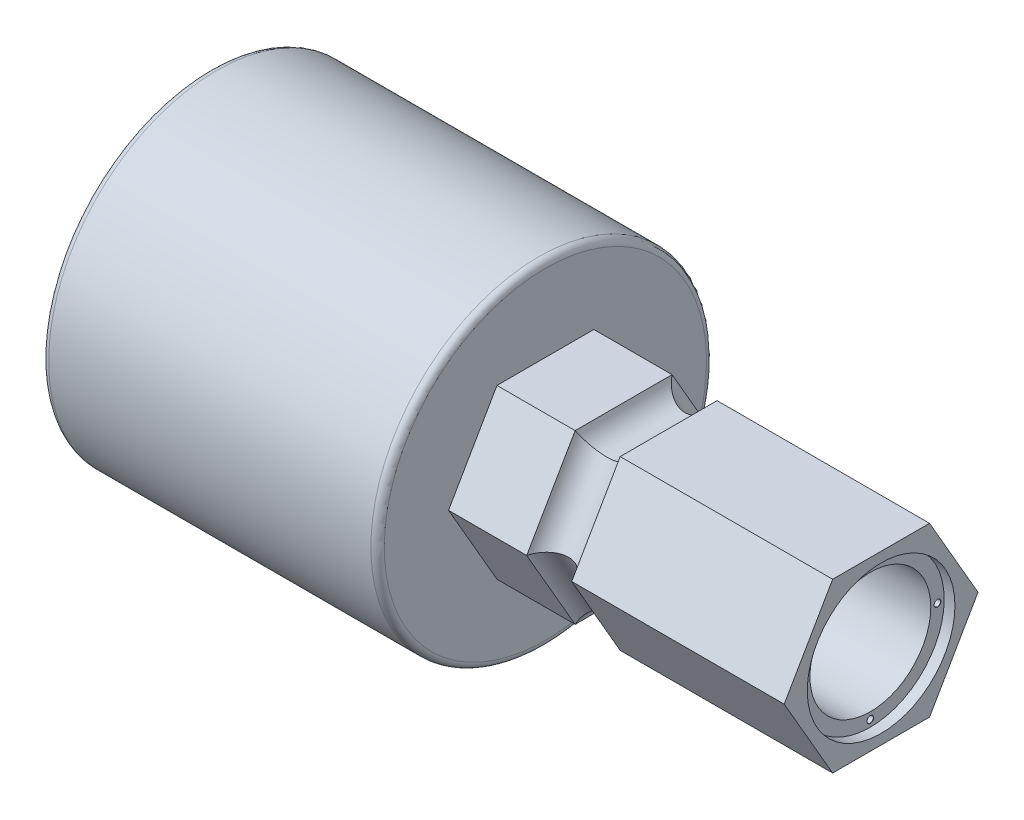
ISO-10303-21;
HEADER;
FILE_DESCRIPTION(('STEP AP214'),'2;1');
FILE_NAME('part.step','',(''),(''),'','','');
FILE_SCHEMA(('AUTOMOTIVE_DESIGN { 1 0 10303 214 1 1 1 1 }'));
ENDSEC;
DATA;
#1=APPLICATION_CONTEXT('core data for automotive mechanical design processes');
#2=APPLICATION_PROTOCOL_DEFINITION('international standard','automotive_design',2000,#1);
#3=PRODUCT_CONTEXT('',#1,'mechanical');
#4=PRODUCT('Part','Part','',(#3));
#5=PRODUCT_RELATED_PRODUCT_CATEGORY('part','',(#4));
#6=PRODUCT_DEFINITION_FORMATION('','',#4);
#7=PRODUCT_DEFINITION_CONTEXT('part definition',#1,'design');
#8=PRODUCT_DEFINITION('design','',#6,#7);
#9=PRODUCT_DEFINITION_SHAPE('','',#8);
#10=(LENGTH_UNIT() NAMED_UNIT(*) SI_UNIT(.MILLI.,.METRE.));
#11=(NAMED_UNIT(*) PLANE_ANGLE_UNIT() SI_UNIT($,.RADIAN.));
#12=(NAMED_UNIT(*) SI_UNIT($,.STERADIAN.) SOLID_ANGLE_UNIT());
#13=UNCERTAINTY_MEASURE_WITH_UNIT(LENGTH_MEASURE(1.E-05),#10,'distance_accuracy_value','');
#14=(GEOMETRIC_REPRESENTATION_CONTEXT(3) GLOBAL_UNCERTAINTY_ASSIGNED_CONTEXT((#13)) GLOBAL_UNIT_ASSIGNED_CONTEXT((#10,
#11,#12)) REPRESENTATION_CONTEXT('',''));
#15=CARTESIAN_POINT('',(0.,0.,0.));
#16=DIRECTION('',(0.,0.,1.));
#17=DIRECTION('',(1.,0.,0.));
#18=AXIS2_PLACEMENT_3D('',#15,#16,#17);
#19=CARTESIAN_POINT('',(135.355339059327,-22.,0.));
#20=DIRECTION('',(-1.,0.,0.));
#21=DIRECTION('',(0.,-1.,0.));
#22=AXIS2_PLACEMENT_3D('',#19,#20,#21);
#23=CYLINDRICAL_SURFACE('',#22,9.);
#24=CARTESIAN_POINT('',(48.,-22.,0.));
#25=DIRECTION('',(1.,0.,0.));
#26=DIRECTION('',(0.,1.,0.));
#27=AXIS2_PLACEMENT_3D('',#24,#25,#26);
#28=CIRCLE('',#27,9.);
#29=CARTESIAN_POINT('',(48.,-13.,0.));
#30=VERTEX_POINT('',#29);
#31=EDGE_CURVE('E11',#30,#30,#28,.F.);
#32=ORIENTED_EDGE('',*,*,#31,.T.);
#33=EDGE_LOOP('',(#32));
#34=FACE_BOUND('',#33,.T.);
#35=CARTESIAN_POINT('',(98.4,-22.,0.));
#36=DIRECTION('',(1.,0.,0.));
#37=DIRECTION('',(0.,0.,-1.));
#38=AXIS2_PLACEMENT_3D('',#35,#36,#37);
#39=CIRCLE('',#38,9.);
#40=CARTESIAN_POINT('',(98.4,-22.,-9.));
#41=VERTEX_POINT('',#40);
#42=EDGE_CURVE('E50',#41,#41,#39,.F.);
#43=ORIENTED_EDGE('',*,*,#42,.F.);
#44=EDGE_LOOP('',(#43));
#45=FACE_BOUND('',#44,.T.);
#46=ADVANCED_FACE('F46',(#34,#45),#23,.F.);
#47=CARTESIAN_POINT('',(48.,-22.,0.));
#48=DIRECTION('',(1.,0.,0.));
#49=DIRECTION('',(0.,1.,0.));
#50=AXIS2_PLACEMENT_3D('',#47,#48,#49);
#51=TOROIDAL_SURFACE('',#50,10.,1.);
#52=CARTESIAN_POINT('',(47.,-22.,0.));
#53=DIRECTION('',(1.,0.,0.));
#54=DIRECTION('',(0.,1.,0.));
#55=AXIS2_PLACEMENT_3D('',#52,#53,#54);
#56=CIRCLE('',#55,10.);
#57=CARTESIAN_POINT('',(47.,-12.,0.));
#58=VERTEX_POINT('',#57);
#59=EDGE_CURVE('E56',#58,#58,#56,.T.);
#60=ORIENTED_EDGE('',*,*,#59,.F.);
#61=EDGE_LOOP('',(#60));
#62=FACE_BOUND('',#61,.T.);
#63=ORIENTED_EDGE('',*,*,#31,.F.);
#64=EDGE_LOOP('',(#63));
#65=FACE_BOUND('',#64,.T.);
#66=ADVANCED_FACE('F48',(#62,#65),#51,.T.);
#67=CARTESIAN_POINT('',(65.,-8.50000000000001,-7.21687836487032));
#68=DIRECTION('',(0.,0.,-1.));
#69=DIRECTION('',(0.,1.,0.));
#70=AXIS2_PLACEMENT_3D('',#67,#68,#69);
#71=CYLINDRICAL_SURFACE('',#70,3.5);
#72=DIRECTION('',(0.,0.,-1.));
#73=VECTOR('',#72,1.);
#74=CARTESIAN_POINT('',(61.6458980337503,-9.49999999999999,-7.21687836487032));
#75=LINE('',#74,#73);
#76=CARTESIAN_POINT('',(61.6458980337503,-9.49999999999998,-7.21687836487032));
#77=VERTEX_POINT('',#76);
#78=CARTESIAN_POINT('',(61.6458980337503,-9.49999999999983,7.21687836487032));
#79=VERTEX_POINT('',#78);
#80=EDGE_CURVE('E255',#77,#79,#75,.F.);
#81=ORIENTED_EDGE('',*,*,#80,.T.);
#82=CARTESIAN_POINT('',(65.,-8.49999999999998,7.79422863405984));
#83=DIRECTION('',(0.,0.499999999999993,-0.866025403784443));
#84=DIRECTION('',(0.,-0.866025403784443,-0.499999999999993));
#85=AXIS2_PLACEMENT_3D('',#82,#83,#84);
#86=ELLIPSE('',#85,4.04145188432737,3.5);
#87=CARTESIAN_POINT('',(68.3541019662497,-9.49999999999984,7.21687836487032));
#88=VERTEX_POINT('',#87);
#89=EDGE_CURVE('E219',#79,#88,#86,.F.);
#90=ORIENTED_EDGE('',*,*,#89,.T.);
#91=DIRECTION('',(0.,0.,-1.));
#92=VECTOR('',#91,1.);
#93=CARTESIAN_POINT('',(68.3541019662497,-9.49999999999999,-7.21687836487032));
#94=LINE('',#93,#92);
#95=CARTESIAN_POINT('',(68.3541019662497,-9.50000000000004,-7.21687836487035));
#96=VERTEX_POINT('',#95);
#97=EDGE_CURVE('E251',#88,#96,#94,.T.);
#98=ORIENTED_EDGE('',*,*,#97,.T.);
#99=CARTESIAN_POINT('',(65.,-8.50000000000001,-7.79422863405999));
#100=DIRECTION('',(0.,-0.500000000000003,-0.866025403784437));
#101=DIRECTION('',(0.,0.866025403784437,-0.500000000000003));
#102=AXIS2_PLACEMENT_3D('',#99,#100,#101);
#103=ELLIPSE('',#102,4.04145188432739,3.5);
#104=EDGE_CURVE('E354',#96,#77,#103,.T.);
#105=ORIENTED_EDGE('',*,*,#104,.T.);
#106=EDGE_LOOP('',(#81,#90,#98,#105));
#107=FACE_BOUND('',#106,.T.);
#108=ADVANCED_FACE('F383',(#107),#71,.F.);
#109=CARTESIAN_POINT('',(100.,-9.49999999999999,7.21687836487032));
#110=DIRECTION('',(0.,-0.5,-0.866025403784439));
#111=DIRECTION('',(0.,0.866025403784439,-0.5));
#112=AXIS2_PLACEMENT_3D('',#109,#110,#111);
#113=PLANE('',#112);
#114=DIRECTION('',(0.,0.866025403784432,-0.500000000000012));
#115=VECTOR('',#114,1.);
#116=CARTESIAN_POINT('',(61.6458980337503,-9.49999999999986,7.21687836487025));
#117=LINE('',#116,#115);
#118=CARTESIAN_POINT('',(61.6458980337503,-21.9999999999999,14.4337567297407));
#119=VERTEX_POINT('',#118);
#120=EDGE_CURVE('E216',#79,#119,#117,.F.);
#121=ORIENTED_EDGE('',*,*,#120,.F.);
#122=DIRECTION('',(-1.,0.,0.));
#123=VECTOR('',#122,1.);
#124=CARTESIAN_POINT('',(100.,-9.49999999999999,7.21687836487032));
#125=LINE('',#124,#123);
#126=CARTESIAN_POINT('',(50.,-9.49999999999999,7.21687836487032));
#127=VERTEX_POINT('',#126);
#128=EDGE_CURVE('E313',#79,#127,#125,.T.);
#129=ORIENTED_EDGE('',*,*,#128,.T.);
#130=DIRECTION('',(0.,-0.866025403784439,0.5));
#131=VECTOR('',#130,1.);
#132=CARTESIAN_POINT('',(50.,-9.49999999999999,7.21687836487032));
#133=LINE('',#132,#131);
#134=CARTESIAN_POINT('',(50.,-22.,14.4337567297407));
#135=VERTEX_POINT('',#134);
#136=EDGE_CURVE('E288',#127,#135,#133,.T.);
#137=ORIENTED_EDGE('',*,*,#136,.T.);
#138=DIRECTION('',(-1.,0.,0.));
#139=VECTOR('',#138,1.);
#140=CARTESIAN_POINT('',(100.,-22.,14.4337567297407));
#141=LINE('',#140,#139);
#142=EDGE_CURVE('E308',#119,#135,#141,.T.);
#143=ORIENTED_EDGE('',*,*,#142,.F.);
#144=EDGE_LOOP('',(#121,#129,#137,#143));
#145=FACE_BOUND('',#144,.T.);
#146=ADVANCED_FACE('F402',(#145),#113,.F.);
#147=DIRECTION('',(0.,0.866025403784432,-0.500000000000012));
#148=VECTOR('',#147,1.);
#149=CARTESIAN_POINT('',(68.3541019662497,-9.49999999999986,7.21687836487025));
#150=LINE('',#149,#148);
#151=CARTESIAN_POINT('',(68.3541019662497,-21.9999999999998,14.4337567297407));
#152=VERTEX_POINT('',#151);
#153=EDGE_CURVE('E213',#152,#88,#150,.T.);
#154=ORIENTED_EDGE('',*,*,#153,.F.);
#155=CARTESIAN_POINT('',(100.,-22.,14.4337567297407));
#156=VERTEX_POINT('',#155);
#157=EDGE_CURVE('E309',#156,#152,#141,.T.);
#158=ORIENTED_EDGE('',*,*,#157,.F.);
#159=DIRECTION('',(0.,-0.866025403784439,0.5));
#160=VECTOR('',#159,1.);
#161=CARTESIAN_POINT('',(100.,-9.49999999999999,7.21687836487032));
#162=LINE('',#161,#160);
#163=CARTESIAN_POINT('',(100.,-9.49999999999999,7.21687836487032));
#164=VERTEX_POINT('',#163);
#165=EDGE_CURVE('E270',#164,#156,#162,.T.);
#166=ORIENTED_EDGE('',*,*,#165,.F.);
#167=EDGE_CURVE('E314',#164,#88,#125,.T.);
#168=ORIENTED_EDGE('',*,*,#167,.T.);
#169=EDGE_LOOP('',(#154,#158,#166,#168));
#170=FACE_BOUND('',#169,.T.);
#171=ADVANCED_FACE('F541',(#170),#113,.F.);
#172=CARTESIAN_POINT('',(65.,-22.4999999999999,15.2997821335251));
#173=DIRECTION('',(0.,0.866025403784444,0.49999999999999));
#174=DIRECTION('',(0.,-0.49999999999999,0.866025403784444));
#175=AXIS2_PLACEMENT_3D('',#172,#173,#174);
#176=CYLINDRICAL_SURFACE('',#175,3.5);
#177=DIRECTION('',(0.,0.866025403784444,0.49999999999999));
#178=VECTOR('',#177,1.);
#179=CARTESIAN_POINT('',(68.3541019662497,-21.9999999999999,14.4337567297407));
#180=LINE('',#179,#178);
#181=CARTESIAN_POINT('',(68.3541019662496,-34.4999999999999,7.21687836487037));
#182=VERTEX_POINT('',#181);
#183=EDGE_CURVE('E223',#182,#152,#180,.T.);
#184=ORIENTED_EDGE('',*,*,#183,.T.);
#185=CARTESIAN_POINT('',(65.,-21.9999999999998,15.5884572681199));
#186=DIRECTION('',(0.,1.,0.));
#187=DIRECTION('',(0.,0.,1.));
#188=AXIS2_PLACEMENT_3D('',#185,#186,#187);
#189=ELLIPSE('',#188,4.04145188432739,3.5);
#190=EDGE_CURVE('E370',#152,#119,#189,.T.);
#191=ORIENTED_EDGE('',*,*,#190,.T.);
#192=DIRECTION('',(0.,0.866025403784444,0.49999999999999));
#193=VECTOR('',#192,1.);
#194=CARTESIAN_POINT('',(61.6458980337503,-21.9999999999999,14.4337567297407));
#195=LINE('',#194,#193);
#196=CARTESIAN_POINT('',(61.6458980337503,-34.5,7.21687836487036));
#197=VERTEX_POINT('',#196);
#198=EDGE_CURVE('E227',#119,#197,#195,.F.);
#199=ORIENTED_EDGE('',*,*,#198,.T.);
#200=CARTESIAN_POINT('',(65.,-35.5,7.79422863406009));
#201=DIRECTION('',(0.,0.500000000000006,0.866025403784435));
#202=DIRECTION('',(0.,-0.866025403784435,0.500000000000006));
#203=AXIS2_PLACEMENT_3D('',#200,#201,#202);
#204=ELLIPSE('',#203,4.04145188432739,3.5);
#205=EDGE_CURVE('E366',#182,#197,#204,.T.);
#206=ORIENTED_EDGE('',*,*,#205,.F.);
#207=EDGE_LOOP('',(#184,#191,#199,#206));
#208=FACE_BOUND('',#207,.T.);
#209=ADVANCED_FACE('F418',(#208),#176,.F.);
#210=CARTESIAN_POINT('',(100.,-22.,14.4337567297407));
#211=DIRECTION('',(0.,0.5,-0.866025403784438));
#212=DIRECTION('',(0.,0.866025403784438,0.5));
#213=AXIS2_PLACEMENT_3D('',#210,#211,#212);
#214=PLANE('',#213);
#215=ORIENTED_EDGE('',*,*,#198,.F.);
#216=ORIENTED_EDGE('',*,*,#142,.T.);
#217=DIRECTION('',(0.,-0.866025403784438,-0.5));
#218=VECTOR('',#217,1.);
#219=CARTESIAN_POINT('',(50.,-22.,14.4337567297407));
#220=LINE('',#219,#218);
#221=CARTESIAN_POINT('',(50.,-34.5,7.21687836487033));
#222=VERTEX_POINT('',#221);
#223=EDGE_CURVE('E292',#135,#222,#220,.T.);
#224=ORIENTED_EDGE('',*,*,#223,.T.);
#225=DIRECTION('',(-1.,0.,0.));
#226=VECTOR('',#225,1.);
#227=CARTESIAN_POINT('',(100.,-34.5,7.21687836487033));
#228=LINE('',#227,#226);
#229=EDGE_CURVE('E303',#197,#222,#228,.T.);
#230=ORIENTED_EDGE('',*,*,#229,.F.);
#231=EDGE_LOOP('',(#215,#216,#224,#230));
#232=FACE_BOUND('',#231,.T.);
#233=ADVANCED_FACE('F416',(#232),#214,.F.);
#234=ORIENTED_EDGE('',*,*,#183,.F.);
#235=CARTESIAN_POINT('',(100.,-34.5,7.21687836487033));
#236=VERTEX_POINT('',#235);
#237=EDGE_CURVE('E304',#236,#182,#228,.T.);
#238=ORIENTED_EDGE('',*,*,#237,.F.);
#239=DIRECTION('',(0.,-0.866025403784438,-0.5));
#240=VECTOR('',#239,1.);
#241=CARTESIAN_POINT('',(100.,-22.,14.4337567297407));
#242=LINE('',#241,#240);
#243=EDGE_CURVE('E273',#156,#236,#242,.T.);
#244=ORIENTED_EDGE('',*,*,#243,.F.);
#245=ORIENTED_EDGE('',*,*,#157,.T.);
#246=EDGE_LOOP('',(#234,#238,#244,#245));
#247=FACE_BOUND('',#246,.T.);
#248=ADVANCED_FACE('F559',(#247),#214,.F.);
#249=CARTESIAN_POINT('',(65.,-35.5,7.21687836487036));
#250=DIRECTION('',(0.,0.,1.));
#251=DIRECTION('',(0.,-1.,0.));
#252=AXIS2_PLACEMENT_3D('',#249,#250,#251);
#253=CYLINDRICAL_SURFACE('',#252,3.5);
#254=DIRECTION('',(0.,0.,1.));
#255=VECTOR('',#254,1.);
#256=CARTESIAN_POINT('',(68.3541019662497,-34.5,7.21687836487035));
#257=LINE('',#256,#255);
#258=CARTESIAN_POINT('',(68.3541019662497,-34.5000000000001,-7.21687836487029));
#259=VERTEX_POINT('',#258);
#260=EDGE_CURVE('E230',#259,#182,#257,.T.);
#261=ORIENTED_EDGE('',*,*,#260,.T.);
#262=ORIENTED_EDGE('',*,*,#205,.T.);
#263=DIRECTION('',(0.,0.,1.));
#264=VECTOR('',#263,1.);
#265=CARTESIAN_POINT('',(61.6458980337503,-34.5,7.21687836487036));
#266=LINE('',#265,#264);
#267=CARTESIAN_POINT('',(61.6458980337504,-34.5,-7.21687836487015));
#268=VERTEX_POINT('',#267);
#269=EDGE_CURVE('E234',#197,#268,#266,.F.);
#270=ORIENTED_EDGE('',*,*,#269,.T.);
#271=CARTESIAN_POINT('',(65.,-35.5,-7.79422863405987));
#272=DIRECTION('',(0.,-0.499999999999996,0.866025403784441));
#273=DIRECTION('',(0.,-0.866025403784441,-0.499999999999996));
#274=AXIS2_PLACEMENT_3D('',#271,#272,#273);
#275=ELLIPSE('',#274,4.04145188432738,3.5);
#276=EDGE_CURVE('E362',#259,#268,#275,.T.);
#277=ORIENTED_EDGE('',*,*,#276,.F.);
#278=EDGE_LOOP('',(#261,#262,#270,#277));
#279=FACE_BOUND('',#278,.T.);
#280=ADVANCED_FACE('F422',(#279),#253,.F.);
#281=CARTESIAN_POINT('',(100.,-34.5,7.21687836487033));
#282=DIRECTION('',(0.,1.,0.));
#283=DIRECTION('',(-1.,0.,0.));
#284=AXIS2_PLACEMENT_3D('',#281,#282,#283);
#285=PLANE('',#284);
#286=ORIENTED_EDGE('',*,*,#269,.F.);
#287=ORIENTED_EDGE('',*,*,#229,.T.);
#288=DIRECTION('',(0.,0.,-1.));
#289=VECTOR('',#288,1.);
#290=CARTESIAN_POINT('',(50.,-34.5,7.21687836487033));
#291=LINE('',#290,#289);
#292=CARTESIAN_POINT('',(50.,-34.5,-7.21687836487032));
#293=VERTEX_POINT('',#292);
#294=EDGE_CURVE('E264',#222,#293,#291,.T.);
#295=ORIENTED_EDGE('',*,*,#294,.T.);
#296=DIRECTION('',(-1.,0.,0.));
#297=VECTOR('',#296,1.);
#298=CARTESIAN_POINT('',(100.,-34.5,-7.21687836487032));
#299=LINE('',#298,#297);
#300=EDGE_CURVE('E279',#268,#293,#299,.T.);
#301=ORIENTED_EDGE('',*,*,#300,.F.);
#302=EDGE_LOOP('',(#286,#287,#295,#301));
#303=FACE_BOUND('',#302,.T.);
#304=ADVANCED_FACE('F426',(#303),#285,.F.);
#305=ORIENTED_EDGE('',*,*,#260,.F.);
#306=CARTESIAN_POINT('',(100.,-34.5,-7.21687836487032));
#307=VERTEX_POINT('',#306);
#308=EDGE_CURVE('E299',#307,#259,#299,.T.);
#309=ORIENTED_EDGE('',*,*,#308,.F.);
#310=DIRECTION('',(0.,0.,-1.));
#311=VECTOR('',#310,1.);
#312=CARTESIAN_POINT('',(100.,-34.5,7.21687836487033));
#313=LINE('',#312,#311);
#314=EDGE_CURVE('E276',#236,#307,#313,.T.);
#315=ORIENTED_EDGE('',*,*,#314,.F.);
#316=ORIENTED_EDGE('',*,*,#237,.T.);
#317=EDGE_LOOP('',(#305,#309,#315,#316));
#318=FACE_BOUND('',#317,.T.);
#319=ADVANCED_FACE('F579',(#318),#285,.F.);
#320=CARTESIAN_POINT('',(65.,-35.0000000000001,-8.08290376865468));
#321=DIRECTION('',(0.,-0.866025403784435,0.500000000000006));
#322=DIRECTION('',(0.,-0.500000000000006,-0.866025403784435));
#323=AXIS2_PLACEMENT_3D('',#320,#321,#322);
#324=CYLINDRICAL_SURFACE('',#323,3.5);
#325=DIRECTION('',(0.,-0.866025403784435,0.500000000000006));
#326=VECTOR('',#325,1.);
#327=CARTESIAN_POINT('',(68.3541019662497,-34.5000000000001,-7.21687836487028));
#328=LINE('',#327,#326);
#329=CARTESIAN_POINT('',(68.3541019662497,-22.0000000000001,-14.4337567297406));
#330=VERTEX_POINT('',#329);
#331=EDGE_CURVE('E237',#330,#259,#328,.T.);
#332=ORIENTED_EDGE('',*,*,#331,.T.);
#333=ORIENTED_EDGE('',*,*,#276,.T.);
#334=DIRECTION('',(0.,-0.866025403784435,0.500000000000006));
#335=VECTOR('',#334,1.);
#336=CARTESIAN_POINT('',(61.6458980337503,-34.5000000000001,-7.21687836487027));
#337=LINE('',#336,#335);
#338=CARTESIAN_POINT('',(61.6458980337503,-22.,-14.4337567297407));
#339=VERTEX_POINT('',#338);
#340=EDGE_CURVE('E241',#268,#339,#337,.F.);
#341=ORIENTED_EDGE('',*,*,#340,.T.);
#342=CARTESIAN_POINT('',(65.,-22.0000000000001,-15.5884572681199));
#343=DIRECTION('',(0.,-1.,0.));
#344=DIRECTION('',(0.,0.,-1.));
#345=AXIS2_PLACEMENT_3D('',#342,#343,#344);
#346=ELLIPSE('',#345,4.04145188432739,3.5);
#347=EDGE_CURVE('E358',#330,#339,#346,.T.);
#348=ORIENTED_EDGE('',*,*,#347,.F.);
#349=EDGE_LOOP('',(#332,#333,#341,#348));
#350=FACE_BOUND('',#349,.T.);
#351=ADVANCED_FACE('F431',(#350),#324,.F.);
#352=CARTESIAN_POINT('',(100.,-34.5,-7.21687836487032));
#353=DIRECTION('',(0.,0.499999999999999,0.866025403784439));
#354=DIRECTION('',(0.,-0.866025403784439,0.499999999999999));
#355=AXIS2_PLACEMENT_3D('',#352,#353,#354);
#356=PLANE('',#355);
#357=ORIENTED_EDGE('',*,*,#340,.F.);
#358=ORIENTED_EDGE('',*,*,#300,.T.);
#359=DIRECTION('',(0.,0.866025403784439,-0.499999999999999));
#360=VECTOR('',#359,1.);
#361=CARTESIAN_POINT('',(50.,-34.5,-7.21687836487032));
#362=LINE('',#361,#360);
#363=CARTESIAN_POINT('',(50.,-22.,-14.4337567297406));
#364=VERTEX_POINT('',#363);
#365=EDGE_CURVE('E259',#293,#364,#362,.T.);
#366=ORIENTED_EDGE('',*,*,#365,.T.);
#367=DIRECTION('',(-1.,0.,0.));
#368=VECTOR('',#367,1.);
#369=CARTESIAN_POINT('',(100.,-22.,-14.4337567297406));
#370=LINE('',#369,#368);
#371=EDGE_CURVE('E63',#339,#364,#370,.T.);
#372=ORIENTED_EDGE('',*,*,#371,.F.);
#373=EDGE_LOOP('',(#357,#358,#366,#372));
#374=FACE_BOUND('',#373,.T.);
#375=ADVANCED_FACE('F429',(#374),#356,.F.);
#376=ORIENTED_EDGE('',*,*,#331,.F.);
#377=CARTESIAN_POINT('',(100.,-22.,-14.4337567297406));
#378=VERTEX_POINT('',#377);
#379=EDGE_CURVE('E322',#378,#330,#370,.T.);
#380=ORIENTED_EDGE('',*,*,#379,.F.);
#381=DIRECTION('',(0.,0.866025403784439,-0.499999999999999));
#382=VECTOR('',#381,1.);
#383=CARTESIAN_POINT('',(100.,-34.5,-7.21687836487032));
#384=LINE('',#383,#382);
#385=EDGE_CURVE('E260',#307,#378,#384,.T.);
#386=ORIENTED_EDGE('',*,*,#385,.F.);
#387=ORIENTED_EDGE('',*,*,#308,.T.);
#388=EDGE_LOOP('',(#376,#380,#386,#387));
#389=FACE_BOUND('',#388,.T.);
#390=ADVANCED_FACE('F445',(#389),#356,.F.);
#391=CARTESIAN_POINT('',(65.,-21.5000000000001,-15.2997821335251));
#392=DIRECTION('',(0.,-0.866025403784441,-0.499999999999996));
#393=DIRECTION('',(0.,0.499999999999996,-0.866025403784441));
#394=AXIS2_PLACEMENT_3D('',#391,#392,#393);
#395=CYLINDRICAL_SURFACE('',#394,3.5);
#396=DIRECTION('',(0.,-0.866025403784441,-0.499999999999996));
#397=VECTOR('',#396,1.);
#398=CARTESIAN_POINT('',(68.3541019662497,-22.,-14.4337567297407));
#399=LINE('',#398,#397);
#400=EDGE_CURVE('E244',#96,#330,#399,.T.);
#401=ORIENTED_EDGE('',*,*,#400,.T.);
#402=ORIENTED_EDGE('',*,*,#347,.T.);
#403=DIRECTION('',(0.,-0.866025403784441,-0.499999999999996));
#404=VECTOR('',#403,1.);
#405=CARTESIAN_POINT('',(61.6458980337503,-22.,-14.4337567297407));
#406=LINE('',#405,#404);
#407=EDGE_CURVE('E248',#339,#77,#406,.F.);
#408=ORIENTED_EDGE('',*,*,#407,.T.);
#409=ORIENTED_EDGE('',*,*,#104,.F.);
#410=EDGE_LOOP('',(#401,#402,#408,#409));
#411=FACE_BOUND('',#410,.T.);
#412=ADVANCED_FACE('F434',(#411),#395,.F.);
#413=CARTESIAN_POINT('',(100.,-22.,-14.4337567297406));
#414=DIRECTION('',(0.,-0.5,0.866025403784439));
#415=DIRECTION('',(0.,-0.866025403784439,-0.5));
#416=AXIS2_PLACEMENT_3D('',#413,#414,#415);
#417=PLANE('',#416);
#418=ORIENTED_EDGE('',*,*,#407,.F.);
#419=ORIENTED_EDGE('',*,*,#371,.T.);
#420=DIRECTION('',(0.,0.866025403784439,0.5));
#421=VECTOR('',#420,1.);
#422=CARTESIAN_POINT('',(50.,-22.,-14.4337567297406));
#423=LINE('',#422,#421);
#424=CARTESIAN_POINT('',(50.,-9.49999999999999,-7.21687836487032));
#425=VERTEX_POINT('',#424);
#426=EDGE_CURVE('E282',#364,#425,#423,.T.);
#427=ORIENTED_EDGE('',*,*,#426,.T.);
#428=DIRECTION('',(-1.,0.,0.));
#429=VECTOR('',#428,1.);
#430=CARTESIAN_POINT('',(100.,-9.49999999999999,-7.21687836487032));
#431=LINE('',#430,#429);
#432=EDGE_CURVE('E71',#77,#425,#431,.T.);
#433=ORIENTED_EDGE('',*,*,#432,.F.);
#434=EDGE_LOOP('',(#418,#419,#427,#433));
#435=FACE_BOUND('',#434,.T.);
#436=ADVANCED_FACE('F436',(#435),#417,.F.);
#437=ORIENTED_EDGE('',*,*,#400,.F.);
#438=CARTESIAN_POINT('',(100.,-9.49999999999999,-7.21687836487032));
#439=VERTEX_POINT('',#438);
#440=EDGE_CURVE('E318',#439,#96,#431,.T.);
#441=ORIENTED_EDGE('',*,*,#440,.F.);
#442=DIRECTION('',(0.,0.866025403784439,0.5));
#443=VECTOR('',#442,1.);
#444=CARTESIAN_POINT('',(100.,-22.,-14.4337567297406));
#445=LINE('',#444,#443);
#446=EDGE_CURVE('E263',#378,#439,#445,.T.);
#447=ORIENTED_EDGE('',*,*,#446,.F.);
#448=ORIENTED_EDGE('',*,*,#379,.T.);
#449=EDGE_LOOP('',(#437,#441,#447,#448));
#450=FACE_BOUND('',#449,.T.);
#451=ADVANCED_FACE('F438',(#450),#417,.F.);
#452=CARTESIAN_POINT('',(100.,-9.49999999999999,-7.21687836487032));
#453=DIRECTION('',(0.,-1.,0.));
#454=DIRECTION('',(1.,0.,0.));
#455=AXIS2_PLACEMENT_3D('',#452,#453,#454);
#456=PLANE('',#455);
#457=ORIENTED_EDGE('',*,*,#80,.F.);
#458=ORIENTED_EDGE('',*,*,#432,.T.);
#459=DIRECTION('',(0.,0.,1.));
#460=VECTOR('',#459,1.);
#461=CARTESIAN_POINT('',(50.,-9.49999999999999,-7.21687836487032));
#462=LINE('',#461,#460);
#463=EDGE_CURVE('E285',#425,#127,#462,.T.);
#464=ORIENTED_EDGE('',*,*,#463,.T.);
#465=ORIENTED_EDGE('',*,*,#128,.F.);
#466=EDGE_LOOP('',(#457,#458,#464,#465));
#467=FACE_BOUND('',#466,.T.);
#468=ADVANCED_FACE('F407',(#467),#456,.F.);
#469=ORIENTED_EDGE('',*,*,#97,.F.);
#470=ORIENTED_EDGE('',*,*,#167,.F.);
#471=DIRECTION('',(0.,0.,1.));
#472=VECTOR('',#471,1.);
#473=CARTESIAN_POINT('',(100.,-9.49999999999999,-7.21687836487032));
#474=LINE('',#473,#472);
#475=EDGE_CURVE('E267',#439,#164,#474,.T.);
#476=ORIENTED_EDGE('',*,*,#475,.F.);
#477=ORIENTED_EDGE('',*,*,#440,.T.);
#478=EDGE_LOOP('',(#469,#470,#476,#477));
#479=FACE_BOUND('',#478,.T.);
#480=ADVANCED_FACE('F464',(#479),#456,.F.);
#481=CARTESIAN_POINT('',(50.,0.,0.));
#482=DIRECTION('',(-1.,0.,0.));
#483=DIRECTION('',(0.,-1.,0.));
#484=AXIS2_PLACEMENT_3D('',#481,#482,#483);
#485=PLANE('',#484);
#486=CARTESIAN_POINT('',(50.,-22.,0.));
#487=DIRECTION('',(1.,0.,0.));
#488=DIRECTION('',(0.,1.,0.));
#489=AXIS2_PLACEMENT_3D('',#486,#487,#488);
#490=CIRCLE('',#489,24.);
#491=CARTESIAN_POINT('',(50.,1.99999999999999,0.));
#492=VERTEX_POINT('',#491);
#493=EDGE_CURVE('E334',#492,#492,#490,.T.);
#494=ORIENTED_EDGE('',*,*,#493,.T.);
#495=EDGE_LOOP('',(#494));
#496=FACE_BOUND('',#495,.T.);
#497=ORIENTED_EDGE('',*,*,#365,.F.);
#498=ORIENTED_EDGE('',*,*,#294,.F.);
#499=ORIENTED_EDGE('',*,*,#223,.F.);
#500=ORIENTED_EDGE('',*,*,#136,.F.);
#501=ORIENTED_EDGE('',*,*,#463,.F.);
#502=ORIENTED_EDGE('',*,*,#426,.F.);
#503=EDGE_LOOP('',(#497,#498,#499,#500,#501,#502));
#504=FACE_BOUND('',#503,.T.);
#505=ADVANCED_FACE('F411',(#496,#504),#485,.F.);
#506=CARTESIAN_POINT('',(1.,-22.,0.));
#507=DIRECTION('',(1.,0.,0.));
#508=DIRECTION('',(0.,1.,0.));
#509=AXIS2_PLACEMENT_3D('',#506,#507,#508);
#510=TOROIDAL_SURFACE('',#509,24.,1.);
#511=CARTESIAN_POINT('',(1.00000000000001,-22.,0.));
#512=DIRECTION('',(1.,0.,0.));
#513=DIRECTION('',(0.,1.,0.));
#514=AXIS2_PLACEMENT_3D('',#511,#512,#513);
#515=CIRCLE('',#514,25.);
#516=CARTESIAN_POINT('',(1.00000000000001,3.,0.));
#517=VERTEX_POINT('',#516);
#518=EDGE_CURVE('E326',#517,#517,#515,.T.);
#519=ORIENTED_EDGE('',*,*,#518,.F.);
#520=EDGE_LOOP('',(#519));
#521=FACE_BOUND('',#520,.T.);
#522=CARTESIAN_POINT('',(0.,-22.,0.));
#523=DIRECTION('',(1.,0.,0.));
#524=DIRECTION('',(0.,1.,0.));
#525=AXIS2_PLACEMENT_3D('',#522,#523,#524);
#526=CIRCLE('',#525,24.);
#527=CARTESIAN_POINT('',(0.,1.99999999999999,0.));
#528=VERTEX_POINT('',#527);
#529=EDGE_CURVE('E350',#528,#528,#526,.T.);
#530=ORIENTED_EDGE('',*,*,#529,.T.);
#531=EDGE_LOOP('',(#530));
#532=FACE_BOUND('',#531,.T.);
#533=ADVANCED_FACE('F463',(#521,#532),#510,.T.);
#534=CARTESIAN_POINT('',(0.,0.,0.));
#535=DIRECTION('',(1.,0.,0.));
#536=DIRECTION('',(0.,1.,0.));
#537=AXIS2_PLACEMENT_3D('',#534,#535,#536);
#538=PLANE('',#537);
#539=ORIENTED_EDGE('',*,*,#529,.F.);
#540=EDGE_LOOP('',(#539));
#541=FACE_BOUND('',#540,.T.);
#542=CARTESIAN_POINT('',(0.,-22.,0.));
#543=DIRECTION('',(1.,0.,0.));
#544=DIRECTION('',(0.,1.,0.));
#545=AXIS2_PLACEMENT_3D('',#542,#543,#544);
#546=CIRCLE('',#545,22.);
#547=CARTESIAN_POINT('',(0.,0.,0.));
#548=VERTEX_POINT('',#547);
#549=EDGE_CURVE('E346',#548,#548,#546,.T.);
#550=ORIENTED_EDGE('',*,*,#549,.T.);
#551=EDGE_LOOP('',(#550));
#552=FACE_BOUND('',#551,.T.);
#553=ADVANCED_FACE('F475',(#541,#552),#538,.F.);
#554=CARTESIAN_POINT('',(50.,-22.,0.));
#555=DIRECTION('',(1.,0.,0.));
#556=DIRECTION('',(0.,1.,0.));
#557=AXIS2_PLACEMENT_3D('',#554,#555,#556);
#558=CYLINDRICAL_SURFACE('',#557,22.);
#559=ORIENTED_EDGE('',*,*,#549,.F.);
#560=EDGE_LOOP('',(#559));
#561=FACE_BOUND('',#560,.T.);
#562=CARTESIAN_POINT('',(46.,-22.,0.));
#563=DIRECTION('',(1.,0.,0.));
#564=DIRECTION('',(0.,1.,0.));
#565=AXIS2_PLACEMENT_3D('',#562,#563,#564);
#566=CIRCLE('',#565,22.);
#567=CARTESIAN_POINT('',(46.,0.,0.));
#568=VERTEX_POINT('',#567);
#569=EDGE_CURVE('E342',#568,#568,#566,.T.);
#570=ORIENTED_EDGE('',*,*,#569,.T.);
#571=EDGE_LOOP('',(#570));
#572=FACE_BOUND('',#571,.T.);
#573=ADVANCED_FACE('F471',(#561,#572),#558,.F.);
#574=CARTESIAN_POINT('',(46.,-22.,0.));
#575=DIRECTION('',(1.,0.,0.));
#576=DIRECTION('',(0.,1.,0.));
#577=AXIS2_PLACEMENT_3D('',#574,#575,#576);
#578=TOROIDAL_SURFACE('',#577,21.,1.);
#579=ORIENTED_EDGE('',*,*,#569,.F.);
#580=EDGE_LOOP('',(#579));
#581=FACE_BOUND('',#580,.T.);
#582=CARTESIAN_POINT('',(47.,-22.,0.));
#583=DIRECTION('',(1.,0.,0.));
#584=DIRECTION('',(0.,1.,0.));
#585=AXIS2_PLACEMENT_3D('',#582,#583,#584);
#586=CIRCLE('',#585,21.);
#587=CARTESIAN_POINT('',(47.,-1.,0.));
#588=VERTEX_POINT('',#587);
#589=EDGE_CURVE('E338',#588,#588,#586,.T.);
#590=ORIENTED_EDGE('',*,*,#589,.T.);
#591=EDGE_LOOP('',(#590));
#592=FACE_BOUND('',#591,.T.);
#593=ADVANCED_FACE('F468',(#581,#592),#578,.F.);
#594=CARTESIAN_POINT('',(47.,0.,0.));
#595=DIRECTION('',(1.,0.,0.));
#596=DIRECTION('',(0.,1.,0.));
#597=AXIS2_PLACEMENT_3D('',#594,#595,#596);
#598=PLANE('',#597);
#599=ORIENTED_EDGE('',*,*,#59,.T.);
#600=EDGE_LOOP('',(#599));
#601=FACE_BOUND('',#600,.T.);
#602=ORIENTED_EDGE('',*,*,#589,.F.);
#603=EDGE_LOOP('',(#602));
#604=FACE_BOUND('',#603,.T.);
#605=ADVANCED_FACE('F378',(#601,#604),#598,.F.);
#606=CARTESIAN_POINT('',(49.,-22.,0.));
#607=DIRECTION('',(1.,0.,0.));
#608=DIRECTION('',(0.,1.,0.));
#609=AXIS2_PLACEMENT_3D('',#606,#607,#608);
#610=TOROIDAL_SURFACE('',#609,24.,1.);
#611=CARTESIAN_POINT('',(49.,-22.,0.));
#612=DIRECTION('',(1.,0.,0.));
#613=DIRECTION('',(0.,1.,0.));
#614=AXIS2_PLACEMENT_3D('',#611,#612,#613);
#615=CIRCLE('',#614,25.);
#616=CARTESIAN_POINT('',(49.,3.,0.));
#617=VERTEX_POINT('',#616);
#618=EDGE_CURVE('E330',#617,#617,#615,.T.);
#619=ORIENTED_EDGE('',*,*,#618,.T.);
#620=EDGE_LOOP('',(#619));
#621=FACE_BOUND('',#620,.T.);
#622=ORIENTED_EDGE('',*,*,#493,.F.);
#623=EDGE_LOOP('',(#622));
#624=FACE_BOUND('',#623,.T.);
#625=ADVANCED_FACE('F456',(#621,#624),#610,.T.);
#626=CARTESIAN_POINT('',(50.,-22.,0.));
#627=DIRECTION('',(1.,0.,0.));
#628=DIRECTION('',(0.,1.,0.));
#629=AXIS2_PLACEMENT_3D('',#626,#627,#628);
#630=CYLINDRICAL_SURFACE('',#629,25.);
#631=ORIENTED_EDGE('',*,*,#618,.F.);
#632=EDGE_LOOP('',(#631));
#633=FACE_BOUND('',#632,.T.);
#634=ORIENTED_EDGE('',*,*,#518,.T.);
#635=EDGE_LOOP('',(#634));
#636=FACE_BOUND('',#635,.T.);
#637=ADVANCED_FACE('F452',(#633,#636),#630,.T.);
#638=CARTESIAN_POINT('',(100.,0.,0.));
#639=DIRECTION('',(1.,0.,0.));
#640=DIRECTION('',(0.,0.,-1.));
#641=AXIS2_PLACEMENT_3D('',#638,#639,#640);
#642=PLANE('',#641);
#643=CARTESIAN_POINT('',(100.,-22.,0.));
#644=DIRECTION('',(1.,0.,0.));
#645=DIRECTION('',(0.,0.,-1.));
#646=AXIS2_PLACEMENT_3D('',#643,#644,#645);
#647=CIRCLE('',#646,11.);
#648=CARTESIAN_POINT('',(100.,-22.,-11.));
#649=VERTEX_POINT('',#648);
#650=EDGE_CURVE('E205',#649,#649,#647,.T.);
#651=ORIENTED_EDGE('',*,*,#650,.F.);
#652=EDGE_LOOP('',(#651));
#653=FACE_BOUND('',#652,.T.);
#654=ORIENTED_EDGE('',*,*,#446,.T.);
#655=ORIENTED_EDGE('',*,*,#475,.T.);
#656=ORIENTED_EDGE('',*,*,#165,.T.);
#657=ORIENTED_EDGE('',*,*,#243,.T.);
#658=ORIENTED_EDGE('',*,*,#314,.T.);
#659=ORIENTED_EDGE('',*,*,#385,.T.);
#660=EDGE_LOOP('',(#654,#655,#656,#657,#658,#659));
#661=FACE_BOUND('',#660,.T.);
#662=ADVANCED_FACE('F455',(#653,#661),#642,.T.);
#663=CARTESIAN_POINT('',(65.,-8.9999999999999,8.08290376865462));
#664=DIRECTION('',(0.,0.866025403784432,-0.500000000000012));
#665=DIRECTION('',(0.,0.500000000000012,0.866025403784432));
#666=AXIS2_PLACEMENT_3D('',#663,#664,#665);
#667=CYLINDRICAL_SURFACE('',#666,3.5);
#668=ORIENTED_EDGE('',*,*,#120,.T.);
#669=ORIENTED_EDGE('',*,*,#190,.F.);
#670=ORIENTED_EDGE('',*,*,#153,.T.);
#671=ORIENTED_EDGE('',*,*,#89,.F.);
#672=EDGE_LOOP('',(#668,#669,#670,#671));
#673=FACE_BOUND('',#672,.T.);
#674=ADVANCED_FACE('F612',(#673),#667,.F.);
#675=CARTESIAN_POINT('',(98.4,-22.,0.));
#676=DIRECTION('',(1.,0.,0.));
#677=DIRECTION('',(0.,0.,-1.));
#678=AXIS2_PLACEMENT_3D('',#675,#676,#677);
#679=PLANE('',#678);
#680=CARTESIAN_POINT('',(98.4,-21.9999999999999,10.));
#681=DIRECTION('',(1.,0.,0.));
#682=DIRECTION('',(0.,0.,-1.));
#683=AXIS2_PLACEMENT_3D('',#680,#681,#682);
#684=CIRCLE('',#683,0.5);
#685=CARTESIAN_POINT('',(98.4,-21.9999999999999,9.5));
#686=VERTEX_POINT('',#685);
#687=EDGE_CURVE('E170',#686,#686,#684,.T.);
#688=ORIENTED_EDGE('',*,*,#687,.F.);
#689=EDGE_LOOP('',(#688));
#690=FACE_BOUND('',#689,.T.);
#691=CARTESIAN_POINT('',(98.4,-32.,0.));
#692=DIRECTION('',(1.,0.,0.));
#693=DIRECTION('',(0.,0.,-1.));
#694=AXIS2_PLACEMENT_3D('',#691,#692,#693);
#695=CIRCLE('',#694,0.5);
#696=CARTESIAN_POINT('',(98.4,-32.,-0.499999999999953));
#697=VERTEX_POINT('',#696);
#698=EDGE_CURVE('E161',#697,#697,#695,.T.);
#699=ORIENTED_EDGE('',*,*,#698,.F.);
#700=EDGE_LOOP('',(#699));
#701=FACE_BOUND('',#700,.T.);
#702=CARTESIAN_POINT('',(98.4,-22.0000000000001,-10.));
#703=DIRECTION('',(1.,0.,0.));
#704=DIRECTION('',(0.,0.,-1.));
#705=AXIS2_PLACEMENT_3D('',#702,#703,#704);
#706=CIRCLE('',#705,0.5);
#707=CARTESIAN_POINT('',(98.4,-22.0000000000001,-10.5));
#708=VERTEX_POINT('',#707);
#709=EDGE_CURVE('E181',#708,#708,#706,.T.);
#710=ORIENTED_EDGE('',*,*,#709,.F.);
#711=EDGE_LOOP('',(#710));
#712=FACE_BOUND('',#711,.T.);
#713=CARTESIAN_POINT('',(98.4,-12.,0.));
#714=DIRECTION('',(1.,0.,0.));
#715=DIRECTION('',(0.,0.,-1.));
#716=AXIS2_PLACEMENT_3D('',#713,#714,#715);
#717=CIRCLE('',#716,0.5);
#718=CARTESIAN_POINT('',(98.4,-12.,-0.500000000000048));
#719=VERTEX_POINT('',#718);
#720=EDGE_CURVE('E193',#719,#719,#717,.T.);
#721=ORIENTED_EDGE('',*,*,#720,.F.);
#722=EDGE_LOOP('',(#721));
#723=FACE_BOUND('',#722,.T.);
#724=CARTESIAN_POINT('',(98.4,-22.,0.));
#725=DIRECTION('',(1.,0.,0.));
#726=DIRECTION('',(0.,0.,-1.));
#727=AXIS2_PLACEMENT_3D('',#724,#725,#726);
#728=CIRCLE('',#727,11.);
#729=CARTESIAN_POINT('',(98.4,-22.,-11.));
#730=VERTEX_POINT('',#729);
#731=EDGE_CURVE('E206',#730,#730,#728,.T.);
#732=ORIENTED_EDGE('',*,*,#731,.T.);
#733=EDGE_LOOP('',(#732));
#734=FACE_BOUND('',#733,.T.);
#735=ORIENTED_EDGE('',*,*,#42,.T.);
#736=EDGE_LOOP('',(#735));
#737=FACE_BOUND('',#736,.T.);
#738=ADVANCED_FACE('F617',(#690,#701,#712,#723,#734,#737),#679,.T.);
#739=CARTESIAN_POINT('',(98.4,-22.,0.));
#740=DIRECTION('',(1.,0.,0.));
#741=DIRECTION('',(0.,0.,-1.));
#742=AXIS2_PLACEMENT_3D('',#739,#740,#741);
#743=CYLINDRICAL_SURFACE('',#742,11.);
#744=ORIENTED_EDGE('',*,*,#731,.F.);
#745=EDGE_LOOP('',(#744));
#746=FACE_BOUND('',#745,.T.);
#747=ORIENTED_EDGE('',*,*,#650,.T.);
#748=EDGE_LOOP('',(#747));
#749=FACE_BOUND('',#748,.T.);
#750=ADVANCED_FACE('F639',(#746,#749),#743,.F.);
#751=CARTESIAN_POINT('',(96.4,-12.,0.));
#752=DIRECTION('',(1.,0.,0.));
#753=DIRECTION('',(0.,0.,-1.));
#754=AXIS2_PLACEMENT_3D('',#751,#752,#753);
#755=CONICAL_SURFACE('',#754,0.475,1.02974425867666);
#756=CARTESIAN_POINT('',(96.1145912059619,-12.,0.));
#757=VERTEX_POINT('',#756);
#758=VERTEX_LOOP('',#757);
#759=FACE_BOUND('',#758,.T.);
#760=CARTESIAN_POINT('',(96.4,-12.,0.));
#761=DIRECTION('',(1.,0.,0.));
#762=DIRECTION('',(0.,0.,-1.));
#763=AXIS2_PLACEMENT_3D('',#760,#761,#762);
#764=CIRCLE('',#763,0.475);
#765=CARTESIAN_POINT('',(96.4,-12.,-0.475000000000046));
#766=VERTEX_POINT('',#765);
#767=EDGE_CURVE('E201',#766,#766,#764,.T.);
#768=ORIENTED_EDGE('',*,*,#767,.T.);
#769=EDGE_LOOP('',(#768));
#770=FACE_BOUND('',#769,.T.);
#771=ADVANCED_FACE('F651',(#759,#770),#755,.F.);
#772=CARTESIAN_POINT('',(98.4,-12.,0.));
#773=DIRECTION('',(1.,0.,0.));
#774=DIRECTION('',(0.,0.,-1.));
#775=AXIS2_PLACEMENT_3D('',#772,#773,#774);
#776=CYLINDRICAL_SURFACE('',#775,0.475);
#777=ORIENTED_EDGE('',*,*,#767,.F.);
#778=EDGE_LOOP('',(#777));
#779=FACE_BOUND('',#778,.T.);
#780=CARTESIAN_POINT('',(98.375,-12.,0.));
#781=DIRECTION('',(1.,0.,0.));
#782=DIRECTION('',(0.,0.,-1.));
#783=AXIS2_PLACEMENT_3D('',#780,#781,#782);
#784=CIRCLE('',#783,0.475);
#785=CARTESIAN_POINT('',(98.375,-12.,-0.475000000000047));
#786=VERTEX_POINT('',#785);
#787=EDGE_CURVE('E197',#786,#786,#784,.T.);
#788=ORIENTED_EDGE('',*,*,#787,.T.);
#789=EDGE_LOOP('',(#788));
#790=FACE_BOUND('',#789,.T.);
#791=ADVANCED_FACE('F662',(#779,#790),#776,.F.);
#792=CARTESIAN_POINT('',(98.4,-12.,0.));
#793=DIRECTION('',(1.,0.,0.));
#794=DIRECTION('',(0.,0.,-1.));
#795=AXIS2_PLACEMENT_3D('',#792,#793,#794);
#796=CONICAL_SURFACE('',#795,0.5,0.785398163397518);
#797=ORIENTED_EDGE('',*,*,#787,.F.);
#798=EDGE_LOOP('',(#797));
#799=FACE_BOUND('',#798,.T.);
#800=ORIENTED_EDGE('',*,*,#720,.T.);
#801=EDGE_LOOP('',(#800));
#802=FACE_BOUND('',#801,.T.);
#803=ADVANCED_FACE('F672',(#799,#802),#796,.F.);
#804=CARTESIAN_POINT('',(96.4,-22.0000000000001,-10.));
#805=DIRECTION('',(1.,0.,0.));
#806=DIRECTION('',(0.,0.,-1.));
#807=AXIS2_PLACEMENT_3D('',#804,#805,#806);
#808=CONICAL_SURFACE('',#807,0.475,1.02974425867666);
#809=CARTESIAN_POINT('',(96.1145912059619,-22.0000000000001,-10.));
#810=VERTEX_POINT('',#809);
#811=VERTEX_LOOP('',#810);
#812=FACE_BOUND('',#811,.T.);
#813=CARTESIAN_POINT('',(96.4,-22.0000000000001,-10.));
#814=DIRECTION('',(1.,0.,0.));
#815=DIRECTION('',(0.,0.,-1.));
#816=AXIS2_PLACEMENT_3D('',#813,#814,#815);
#817=CIRCLE('',#816,0.475);
#818=CARTESIAN_POINT('',(96.4,-22.0000000000001,-10.475));
#819=VERTEX_POINT('',#818);
#820=EDGE_CURVE('E189',#819,#819,#817,.T.);
#821=ORIENTED_EDGE('',*,*,#820,.T.);
#822=EDGE_LOOP('',(#821));
#823=FACE_BOUND('',#822,.T.);
#824=ADVANCED_FACE('F681',(#812,#823),#808,.F.);
#825=CARTESIAN_POINT('',(98.4,-22.0000000000001,-10.));
#826=DIRECTION('',(1.,0.,0.));
#827=DIRECTION('',(0.,0.,-1.));
#828=AXIS2_PLACEMENT_3D('',#825,#826,#827);
#829=CYLINDRICAL_SURFACE('',#828,0.475);
#830=ORIENTED_EDGE('',*,*,#820,.F.);
#831=EDGE_LOOP('',(#830));
#832=FACE_BOUND('',#831,.T.);
#833=CARTESIAN_POINT('',(98.375,-22.0000000000001,-10.));
#834=DIRECTION('',(1.,0.,0.));
#835=DIRECTION('',(0.,0.,-1.));
#836=AXIS2_PLACEMENT_3D('',#833,#834,#835);
#837=CIRCLE('',#836,0.475);
#838=CARTESIAN_POINT('',(98.375,-22.0000000000001,-10.475));
#839=VERTEX_POINT('',#838);
#840=EDGE_CURVE('E185',#839,#839,#837,.T.);
#841=ORIENTED_EDGE('',*,*,#840,.T.);
#842=EDGE_LOOP('',(#841));
#843=FACE_BOUND('',#842,.T.);
#844=ADVANCED_FACE('F690',(#832,#843),#829,.F.);
#845=CARTESIAN_POINT('',(98.4,-22.0000000000001,-10.));
#846=DIRECTION('',(1.,0.,0.));
#847=DIRECTION('',(0.,0.,-1.));
#848=AXIS2_PLACEMENT_3D('',#845,#846,#847);
#849=CONICAL_SURFACE('',#848,0.5,0.785398163397518);
#850=ORIENTED_EDGE('',*,*,#840,.F.);
#851=EDGE_LOOP('',(#850));
#852=FACE_BOUND('',#851,.T.);
#853=ORIENTED_EDGE('',*,*,#709,.T.);
#854=EDGE_LOOP('',(#853));
#855=FACE_BOUND('',#854,.T.);
#856=ADVANCED_FACE('F700',(#852,#855),#849,.F.);
#857=CARTESIAN_POINT('',(96.4,-32.,0.));
#858=DIRECTION('',(1.,0.,0.));
#859=DIRECTION('',(0.,0.,-1.));
#860=AXIS2_PLACEMENT_3D('',#857,#858,#859);
#861=CONICAL_SURFACE('',#860,0.474999999999996,1.02974425867666);
#862=CARTESIAN_POINT('',(96.1145912059619,-32.,0.));
#863=VERTEX_POINT('',#862);
#864=VERTEX_LOOP('',#863);
#865=FACE_BOUND('',#864,.T.);
#866=CARTESIAN_POINT('',(96.4,-32.,0.));
#867=DIRECTION('',(1.,0.,0.));
#868=DIRECTION('',(0.,0.,-1.));
#869=AXIS2_PLACEMENT_3D('',#866,#867,#868);
#870=CIRCLE('',#869,0.474999999999996);
#871=CARTESIAN_POINT('',(96.4,-32.,-0.474999999999948));
#872=VERTEX_POINT('',#871);
#873=EDGE_CURVE('E177',#872,#872,#870,.T.);
#874=ORIENTED_EDGE('',*,*,#873,.T.);
#875=EDGE_LOOP('',(#874));
#876=FACE_BOUND('',#875,.T.);
#877=ADVANCED_FACE('F710',(#865,#876),#861,.F.);
#878=CARTESIAN_POINT('',(98.4,-32.,0.));
#879=DIRECTION('',(1.,0.,0.));
#880=DIRECTION('',(0.,0.,-1.));
#881=AXIS2_PLACEMENT_3D('',#878,#879,#880);
#882=CYLINDRICAL_SURFACE('',#881,0.474999999999996);
#883=ORIENTED_EDGE('',*,*,#873,.F.);
#884=EDGE_LOOP('',(#883));
#885=FACE_BOUND('',#884,.T.);
#886=CARTESIAN_POINT('',(98.375,-32.,0.));
#887=DIRECTION('',(1.,0.,0.));
#888=DIRECTION('',(0.,0.,-1.));
#889=AXIS2_PLACEMENT_3D('',#886,#887,#888);
#890=CIRCLE('',#889,0.474999999999996);
#891=CARTESIAN_POINT('',(98.375,-32.,-0.474999999999949));
#892=VERTEX_POINT('',#891);
#893=EDGE_CURVE('E167',#892,#892,#890,.T.);
#894=ORIENTED_EDGE('',*,*,#893,.T.);
#895=EDGE_LOOP('',(#894));
#896=FACE_BOUND('',#895,.T.);
#897=ADVANCED_FACE('F720',(#885,#896),#882,.F.);
#898=CARTESIAN_POINT('',(98.4,-32.,0.));
#899=DIRECTION('',(1.,0.,0.));
#900=DIRECTION('',(0.,0.,-1.));
#901=AXIS2_PLACEMENT_3D('',#898,#899,#900);
#902=CONICAL_SURFACE('',#901,0.5,0.785398163397587);
#903=ORIENTED_EDGE('',*,*,#893,.F.);
#904=EDGE_LOOP('',(#903));
#905=FACE_BOUND('',#904,.T.);
#906=ORIENTED_EDGE('',*,*,#698,.T.);
#907=EDGE_LOOP('',(#906));
#908=FACE_BOUND('',#907,.T.);
#909=ADVANCED_FACE('F154',(#905,#908),#902,.F.);
#910=CARTESIAN_POINT('',(96.4,-21.9999999999999,10.));
#911=DIRECTION('',(1.,0.,0.));
#912=DIRECTION('',(0.,0.,-1.));
#913=AXIS2_PLACEMENT_3D('',#910,#911,#912);
#914=CONICAL_SURFACE('',#913,0.475,1.02974425867666);
#915=CARTESIAN_POINT('',(96.1145912059619,-21.9999999999999,10.));
#916=VERTEX_POINT('',#915);
#917=VERTEX_LOOP('',#916);
#918=FACE_BOUND('',#917,.T.);
#919=CARTESIAN_POINT('',(96.4,-21.9999999999999,10.));
#920=DIRECTION('',(1.,0.,0.));
#921=DIRECTION('',(0.,0.,-1.));
#922=AXIS2_PLACEMENT_3D('',#919,#920,#921);
#923=CIRCLE('',#922,0.475);
#924=CARTESIAN_POINT('',(96.4,-21.9999999999999,9.525));
#925=VERTEX_POINT('',#924);
#926=EDGE_CURVE('E158',#925,#925,#923,.T.);
#927=ORIENTED_EDGE('',*,*,#926,.T.);
#928=EDGE_LOOP('',(#927));
#929=FACE_BOUND('',#928,.T.);
#930=ADVANCED_FACE('F150',(#918,#929),#914,.F.);
#931=CARTESIAN_POINT('',(98.4,-21.9999999999999,10.));
#932=DIRECTION('',(1.,0.,0.));
#933=DIRECTION('',(0.,0.,-1.));
#934=AXIS2_PLACEMENT_3D('',#931,#932,#933);
#935=CYLINDRICAL_SURFACE('',#934,0.475);
#936=ORIENTED_EDGE('',*,*,#926,.F.);
#937=EDGE_LOOP('',(#936));
#938=FACE_BOUND('',#937,.T.);
#939=CARTESIAN_POINT('',(98.375,-21.9999999999999,10.));
#940=DIRECTION('',(1.,0.,0.));
#941=DIRECTION('',(0.,0.,-1.));
#942=AXIS2_PLACEMENT_3D('',#939,#940,#941);
#943=CIRCLE('',#942,0.475);
#944=CARTESIAN_POINT('',(98.375,-21.9999999999999,9.525));
#945=VERTEX_POINT('',#944);
#946=EDGE_CURVE('E162',#945,#945,#943,.T.);
#947=ORIENTED_EDGE('',*,*,#946,.T.);
#948=EDGE_LOOP('',(#947));
#949=FACE_BOUND('',#948,.T.);
#950=ADVANCED_FACE('F153',(#938,#949),#935,.F.);
#951=CARTESIAN_POINT('',(98.4,-21.9999999999999,10.));
#952=DIRECTION('',(1.,0.,0.));
#953=DIRECTION('',(0.,0.,-1.));
#954=AXIS2_PLACEMENT_3D('',#951,#952,#953);
#955=CONICAL_SURFACE('',#954,0.5,0.785398163397518);
#956=ORIENTED_EDGE('',*,*,#946,.F.);
#957=EDGE_LOOP('',(#956));
#958=FACE_BOUND('',#957,.T.);
#959=ORIENTED_EDGE('',*,*,#687,.T.);
#960=EDGE_LOOP('',(#959));
#961=FACE_BOUND('',#960,.T.);
#962=ADVANCED_FACE('F754',(#958,#961),#955,.F.);
#963=CLOSED_SHELL('',(#46,#66,#108,#146,#171,#209,#233,#248,#280,#304,#319,#351,#375,#390,#412,
#436,#451,#468,#480,#505,#533,#553,#573,#593,#605,#625,#637,#662,#674,#738,#750,#771,#791,#803,
#824,#844,#856,#877,#897,#909,#930,#950,#962));
#964=MANIFOLD_SOLID_BREP('B2',#963);
#965=ADVANCED_BREP_SHAPE_REPRESENTATION('',(#18,#964),#14);
#966=SHAPE_DEFINITION_REPRESENTATION(#9,#965);
ENDSEC;
END-ISO-10303-21;
